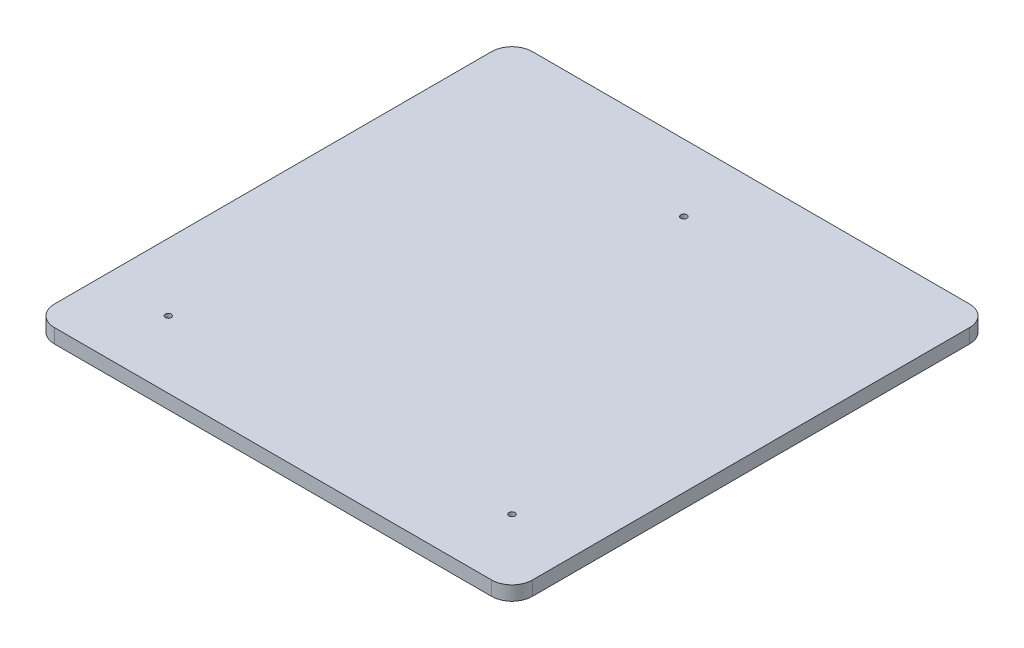
ISO-10303-21;
HEADER;
FILE_DESCRIPTION(('STEP AP214'),'2;1');
FILE_NAME('part.step','',(''),(''),'','','');
FILE_SCHEMA(('AUTOMOTIVE_DESIGN { 1 0 10303 214 1 1 1 1 }'));
ENDSEC;
DATA;
#1=APPLICATION_CONTEXT('core data for automotive mechanical design processes');
#2=APPLICATION_PROTOCOL_DEFINITION('international standard','automotive_design',2000,#1);
#3=PRODUCT_CONTEXT('',#1,'mechanical');
#4=PRODUCT('Part','Part','',(#3));
#5=PRODUCT_RELATED_PRODUCT_CATEGORY('part','',(#4));
#6=PRODUCT_DEFINITION_FORMATION('','',#4);
#7=PRODUCT_DEFINITION_CONTEXT('part definition',#1,'design');
#8=PRODUCT_DEFINITION('design','',#6,#7);
#9=PRODUCT_DEFINITION_SHAPE('','',#8);
#10=(LENGTH_UNIT() NAMED_UNIT(*) SI_UNIT(.MILLI.,.METRE.));
#11=(NAMED_UNIT(*) PLANE_ANGLE_UNIT() SI_UNIT($,.RADIAN.));
#12=(NAMED_UNIT(*) SI_UNIT($,.STERADIAN.) SOLID_ANGLE_UNIT());
#13=UNCERTAINTY_MEASURE_WITH_UNIT(LENGTH_MEASURE(1.E-05),#10,'distance_accuracy_value','');
#14=(GEOMETRIC_REPRESENTATION_CONTEXT(3) GLOBAL_UNCERTAINTY_ASSIGNED_CONTEXT((#13)) GLOBAL_UNIT_ASSIGNED_CONTEXT((#10,
#11,#12)) REPRESENTATION_CONTEXT('',''));
#15=CARTESIAN_POINT('',(0.,0.,0.));
#16=DIRECTION('',(0.,0.,1.));
#17=DIRECTION('',(1.,0.,0.));
#18=AXIS2_PLACEMENT_3D('',#15,#16,#17);
#19=CARTESIAN_POINT('',(0.,7.,0.));
#20=DIRECTION('',(0.,-1.,0.));
#21=DIRECTION('',(0.,0.,-1.));
#22=AXIS2_PLACEMENT_3D('',#19,#20,#21);
#23=PLANE('',#22);
#24=DIRECTION('',(0.,0.,1.));
#25=VECTOR('',#24,1.);
#26=CARTESIAN_POINT('',(-117.5,7.,117.5));
#27=LINE('',#26,#25);
#28=CARTESIAN_POINT('',(-117.5,7.,-107.5));
#29=VERTEX_POINT('',#28);
#30=CARTESIAN_POINT('',(-117.5,7.,107.5));
#31=VERTEX_POINT('',#30);
#32=EDGE_CURVE('E176',#29,#31,#27,.T.);
#33=ORIENTED_EDGE('',*,*,#32,.T.);
#34=CARTESIAN_POINT('',(-107.5,7.,107.5));
#35=DIRECTION('',(0.,-1.,0.));
#36=DIRECTION('',(0.,0.,-1.));
#37=AXIS2_PLACEMENT_3D('',#34,#35,#36);
#38=CIRCLE('',#37,10.);
#39=CARTESIAN_POINT('',(-107.5,7.,117.5));
#40=VERTEX_POINT('',#39);
#41=EDGE_CURVE('E153',#31,#40,#38,.F.);
#42=ORIENTED_EDGE('',*,*,#41,.T.);
#43=DIRECTION('',(1.,0.,0.));
#44=VECTOR('',#43,1.);
#45=CARTESIAN_POINT('',(-117.5,7.,117.5));
#46=LINE('',#45,#44);
#47=CARTESIAN_POINT('',(107.5,7.,117.5));
#48=VERTEX_POINT('',#47);
#49=EDGE_CURVE('E124',#40,#48,#46,.T.);
#50=ORIENTED_EDGE('',*,*,#49,.T.);
#51=CARTESIAN_POINT('',(107.5,7.,107.5));
#52=DIRECTION('',(0.,-1.,0.));
#53=DIRECTION('',(0.,0.,-1.));
#54=AXIS2_PLACEMENT_3D('',#51,#52,#53);
#55=CIRCLE('',#54,10.);
#56=CARTESIAN_POINT('',(117.5,7.,107.5));
#57=VERTEX_POINT('',#56);
#58=EDGE_CURVE('E148',#48,#57,#55,.F.);
#59=ORIENTED_EDGE('',*,*,#58,.T.);
#60=DIRECTION('',(0.,0.,-1.));
#61=VECTOR('',#60,1.);
#62=CARTESIAN_POINT('',(117.5,7.,117.5));
#63=LINE('',#62,#61);
#64=CARTESIAN_POINT('',(117.5,7.,-107.5));
#65=VERTEX_POINT('',#64);
#66=EDGE_CURVE('E131',#57,#65,#63,.T.);
#67=ORIENTED_EDGE('',*,*,#66,.T.);
#68=CARTESIAN_POINT('',(107.5,7.,-107.5));
#69=DIRECTION('',(0.,-1.,0.));
#70=DIRECTION('',(0.,0.,-1.));
#71=AXIS2_PLACEMENT_3D('',#68,#69,#70);
#72=CIRCLE('',#71,10.);
#73=CARTESIAN_POINT('',(107.5,7.,-117.5));
#74=VERTEX_POINT('',#73);
#75=EDGE_CURVE('E60',#65,#74,#72,.F.);
#76=ORIENTED_EDGE('',*,*,#75,.T.);
#77=DIRECTION('',(-1.,0.,0.));
#78=VECTOR('',#77,1.);
#79=CARTESIAN_POINT('',(-117.5,7.,-117.5));
#80=LINE('',#79,#78);
#81=CARTESIAN_POINT('',(-107.5,7.,-117.5));
#82=VERTEX_POINT('',#81);
#83=EDGE_CURVE('E134',#74,#82,#80,.T.);
#84=ORIENTED_EDGE('',*,*,#83,.T.);
#85=CARTESIAN_POINT('',(-107.5,7.,-107.5));
#86=DIRECTION('',(0.,-1.,0.));
#87=DIRECTION('',(0.,0.,-1.));
#88=AXIS2_PLACEMENT_3D('',#85,#86,#87);
#89=CIRCLE('',#88,10.);
#90=EDGE_CURVE('E151',#82,#29,#89,.F.);
#91=ORIENTED_EDGE('',*,*,#90,.T.);
#92=EDGE_LOOP('',(#33,#42,#50,#59,#67,#76,#84,#91));
#93=FACE_BOUND('',#92,.T.);
#94=CARTESIAN_POINT('',(84.5,7.,84.4999999999999));
#95=DIRECTION('',(0.,1.,0.));
#96=DIRECTION('',(0.,0.,1.));
#97=AXIS2_PLACEMENT_3D('',#94,#95,#96);
#98=CIRCLE('',#97,1.5);
#99=CARTESIAN_POINT('',(84.5,7.,86.));
#100=VERTEX_POINT('',#99);
#101=EDGE_CURVE('E169',#100,#100,#98,.T.);
#102=ORIENTED_EDGE('',*,*,#101,.F.);
#103=EDGE_LOOP('',(#102));
#104=FACE_BOUND('',#103,.T.);
#105=CARTESIAN_POINT('',(-84.5,7.,84.5));
#106=DIRECTION('',(0.,1.,0.));
#107=DIRECTION('',(0.,0.,1.));
#108=AXIS2_PLACEMENT_3D('',#105,#106,#107);
#109=CIRCLE('',#108,1.5);
#110=CARTESIAN_POINT('',(-84.5,7.,86.));
#111=VERTEX_POINT('',#110);
#112=EDGE_CURVE('E181',#111,#111,#109,.T.);
#113=ORIENTED_EDGE('',*,*,#112,.F.);
#114=EDGE_LOOP('',(#113));
#115=FACE_BOUND('',#114,.T.);
#116=CARTESIAN_POINT('',(0.,7.,-84.5));
#117=DIRECTION('',(0.,1.,0.));
#118=DIRECTION('',(0.,0.,1.));
#119=AXIS2_PLACEMENT_3D('',#116,#117,#118);
#120=CIRCLE('',#119,1.5);
#121=CARTESIAN_POINT('',(0.,7.,-83.));
#122=VERTEX_POINT('',#121);
#123=EDGE_CURVE('E186',#122,#122,#120,.T.);
#124=ORIENTED_EDGE('',*,*,#123,.F.);
#125=EDGE_LOOP('',(#124));
#126=FACE_BOUND('',#125,.T.);
#127=ADVANCED_FACE('F38',(#93,#104,#115,#126),#23,.F.);
#128=CARTESIAN_POINT('',(0.,0.,0.));
#129=DIRECTION('',(0.,-1.,0.));
#130=DIRECTION('',(0.,0.,-1.));
#131=AXIS2_PLACEMENT_3D('',#128,#129,#130);
#132=PLANE('',#131);
#133=CARTESIAN_POINT('',(-84.5,0.,84.5));
#134=DIRECTION('',(0.,1.,0.));
#135=DIRECTION('',(0.,0.,1.));
#136=AXIS2_PLACEMENT_3D('',#133,#134,#135);
#137=CIRCLE('',#136,1.5);
#138=CARTESIAN_POINT('',(-84.5,0.,86.));
#139=VERTEX_POINT('',#138);
#140=EDGE_CURVE('E183',#139,#139,#137,.T.);
#141=ORIENTED_EDGE('',*,*,#140,.T.);
#142=EDGE_LOOP('',(#141));
#143=FACE_BOUND('',#142,.T.);
#144=DIRECTION('',(1.,0.,0.));
#145=VECTOR('',#144,1.);
#146=CARTESIAN_POINT('',(-117.5,0.,117.5));
#147=LINE('',#146,#145);
#148=CARTESIAN_POINT('',(-107.5,0.,117.5));
#149=VERTEX_POINT('',#148);
#150=CARTESIAN_POINT('',(107.5,0.,117.5));
#151=VERTEX_POINT('',#150);
#152=EDGE_CURVE('E121',#149,#151,#147,.T.);
#153=ORIENTED_EDGE('',*,*,#152,.F.);
#154=CARTESIAN_POINT('',(-107.5,0.,107.5));
#155=DIRECTION('',(0.,-1.,0.));
#156=DIRECTION('',(0.,0.,-1.));
#157=AXIS2_PLACEMENT_3D('',#154,#155,#156);
#158=CIRCLE('',#157,10.);
#159=CARTESIAN_POINT('',(-117.5,0.,107.5));
#160=VERTEX_POINT('',#159);
#161=EDGE_CURVE('E104',#149,#160,#158,.T.);
#162=ORIENTED_EDGE('',*,*,#161,.T.);
#163=DIRECTION('',(0.,0.,1.));
#164=VECTOR('',#163,1.);
#165=CARTESIAN_POINT('',(-117.5,0.,117.5));
#166=LINE('',#165,#164);
#167=CARTESIAN_POINT('',(-117.5,0.,-107.5));
#168=VERTEX_POINT('',#167);
#169=EDGE_CURVE('E132',#168,#160,#166,.T.);
#170=ORIENTED_EDGE('',*,*,#169,.F.);
#171=CARTESIAN_POINT('',(-107.5,0.,-107.5));
#172=DIRECTION('',(0.,-1.,0.));
#173=DIRECTION('',(0.,0.,-1.));
#174=AXIS2_PLACEMENT_3D('',#171,#172,#173);
#175=CIRCLE('',#174,10.);
#176=CARTESIAN_POINT('',(-107.5,0.,-117.5));
#177=VERTEX_POINT('',#176);
#178=EDGE_CURVE('E115',#168,#177,#175,.T.);
#179=ORIENTED_EDGE('',*,*,#178,.T.);
#180=DIRECTION('',(-1.,0.,0.));
#181=VECTOR('',#180,1.);
#182=CARTESIAN_POINT('',(-117.5,0.,-117.5));
#183=LINE('',#182,#181);
#184=CARTESIAN_POINT('',(107.5,0.,-117.5));
#185=VERTEX_POINT('',#184);
#186=EDGE_CURVE('E136',#185,#177,#183,.T.);
#187=ORIENTED_EDGE('',*,*,#186,.F.);
#188=CARTESIAN_POINT('',(107.5,0.,-107.5));
#189=DIRECTION('',(0.,-1.,0.));
#190=DIRECTION('',(0.,0.,-1.));
#191=AXIS2_PLACEMENT_3D('',#188,#189,#190);
#192=CIRCLE('',#191,10.);
#193=CARTESIAN_POINT('',(117.5,0.,-107.5));
#194=VERTEX_POINT('',#193);
#195=EDGE_CURVE('E142',#185,#194,#192,.T.);
#196=ORIENTED_EDGE('',*,*,#195,.T.);
#197=DIRECTION('',(0.,0.,-1.));
#198=VECTOR('',#197,1.);
#199=CARTESIAN_POINT('',(117.5,0.,117.5));
#200=LINE('',#199,#198);
#201=CARTESIAN_POINT('',(117.5,0.,107.5));
#202=VERTEX_POINT('',#201);
#203=EDGE_CURVE('E164',#202,#194,#200,.T.);
#204=ORIENTED_EDGE('',*,*,#203,.F.);
#205=CARTESIAN_POINT('',(107.5,0.,107.5));
#206=DIRECTION('',(0.,-1.,0.));
#207=DIRECTION('',(0.,0.,-1.));
#208=AXIS2_PLACEMENT_3D('',#205,#206,#207);
#209=CIRCLE('',#208,10.);
#210=EDGE_CURVE('E125',#202,#151,#209,.T.);
#211=ORIENTED_EDGE('',*,*,#210,.T.);
#212=EDGE_LOOP('',(#153,#162,#170,#179,#187,#196,#204,#211));
#213=FACE_BOUND('',#212,.T.);
#214=CARTESIAN_POINT('',(84.5,0.,84.4999999999999));
#215=DIRECTION('',(0.,1.,0.));
#216=DIRECTION('',(0.,0.,1.));
#217=AXIS2_PLACEMENT_3D('',#214,#215,#216);
#218=CIRCLE('',#217,1.5);
#219=CARTESIAN_POINT('',(84.5,0.,86.));
#220=VERTEX_POINT('',#219);
#221=EDGE_CURVE('E172',#220,#220,#218,.T.);
#222=ORIENTED_EDGE('',*,*,#221,.T.);
#223=EDGE_LOOP('',(#222));
#224=FACE_BOUND('',#223,.T.);
#225=CARTESIAN_POINT('',(0.,0.,-84.5));
#226=DIRECTION('',(0.,1.,0.));
#227=DIRECTION('',(0.,0.,1.));
#228=AXIS2_PLACEMENT_3D('',#225,#226,#227);
#229=CIRCLE('',#228,1.5);
#230=CARTESIAN_POINT('',(0.,0.,-83.));
#231=VERTEX_POINT('',#230);
#232=EDGE_CURVE('E189',#231,#231,#229,.T.);
#233=ORIENTED_EDGE('',*,*,#232,.T.);
#234=EDGE_LOOP('',(#233));
#235=FACE_BOUND('',#234,.T.);
#236=ADVANCED_FACE('F128',(#143,#213,#224,#235),#132,.T.);
#237=CARTESIAN_POINT('',(117.5,7.,117.5));
#238=DIRECTION('',(-1.,0.,0.));
#239=DIRECTION('',(0.,0.,1.));
#240=AXIS2_PLACEMENT_3D('',#237,#238,#239);
#241=PLANE('',#240);
#242=ORIENTED_EDGE('',*,*,#203,.T.);
#243=DIRECTION('',(0.,-1.,0.));
#244=VECTOR('',#243,1.);
#245=CARTESIAN_POINT('',(117.5,7.,-107.5));
#246=LINE('',#245,#244);
#247=EDGE_CURVE('E11',#194,#65,#246,.F.);
#248=ORIENTED_EDGE('',*,*,#247,.T.);
#249=ORIENTED_EDGE('',*,*,#66,.F.);
#250=DIRECTION('',(0.,-1.,0.));
#251=VECTOR('',#250,1.);
#252=CARTESIAN_POINT('',(117.5,7.,107.5));
#253=LINE('',#252,#251);
#254=EDGE_CURVE('E46',#57,#202,#253,.T.);
#255=ORIENTED_EDGE('',*,*,#254,.T.);
#256=EDGE_LOOP('',(#242,#248,#249,#255));
#257=FACE_BOUND('',#256,.T.);
#258=ADVANCED_FACE('F163',(#257),#241,.F.);
#259=CARTESIAN_POINT('',(-117.5,7.,-117.5));
#260=DIRECTION('',(0.,0.,1.));
#261=DIRECTION('',(1.,0.,0.));
#262=AXIS2_PLACEMENT_3D('',#259,#260,#261);
#263=PLANE('',#262);
#264=ORIENTED_EDGE('',*,*,#186,.T.);
#265=DIRECTION('',(0.,-1.,0.));
#266=VECTOR('',#265,1.);
#267=CARTESIAN_POINT('',(-107.5,7.,-117.5));
#268=LINE('',#267,#266);
#269=EDGE_CURVE('E53',#177,#82,#268,.F.);
#270=ORIENTED_EDGE('',*,*,#269,.T.);
#271=ORIENTED_EDGE('',*,*,#83,.F.);
#272=DIRECTION('',(0.,-1.,0.));
#273=VECTOR('',#272,1.);
#274=CARTESIAN_POINT('',(107.5,7.,-117.5));
#275=LINE('',#274,#273);
#276=EDGE_CURVE('E155',#74,#185,#275,.T.);
#277=ORIENTED_EDGE('',*,*,#276,.T.);
#278=EDGE_LOOP('',(#264,#270,#271,#277));
#279=FACE_BOUND('',#278,.T.);
#280=ADVANCED_FACE('F215',(#279),#263,.F.);
#281=CARTESIAN_POINT('',(-117.5,7.,117.5));
#282=DIRECTION('',(1.,0.,0.));
#283=DIRECTION('',(0.,0.,-1.));
#284=AXIS2_PLACEMENT_3D('',#281,#282,#283);
#285=PLANE('',#284);
#286=ORIENTED_EDGE('',*,*,#169,.T.);
#287=DIRECTION('',(0.,-1.,0.));
#288=VECTOR('',#287,1.);
#289=CARTESIAN_POINT('',(-117.5,7.,107.5));
#290=LINE('',#289,#288);
#291=EDGE_CURVE('E109',#160,#31,#290,.F.);
#292=ORIENTED_EDGE('',*,*,#291,.T.);
#293=ORIENTED_EDGE('',*,*,#32,.F.);
#294=DIRECTION('',(0.,-1.,0.));
#295=VECTOR('',#294,1.);
#296=CARTESIAN_POINT('',(-117.5,7.,-107.5));
#297=LINE('',#296,#295);
#298=EDGE_CURVE('E114',#29,#168,#297,.T.);
#299=ORIENTED_EDGE('',*,*,#298,.T.);
#300=EDGE_LOOP('',(#286,#292,#293,#299));
#301=FACE_BOUND('',#300,.T.);
#302=ADVANCED_FACE('F212',(#301),#285,.F.);
#303=CARTESIAN_POINT('',(-117.5,7.,117.5));
#304=DIRECTION('',(0.,0.,-1.));
#305=DIRECTION('',(-1.,0.,0.));
#306=AXIS2_PLACEMENT_3D('',#303,#304,#305);
#307=PLANE('',#306);
#308=ORIENTED_EDGE('',*,*,#49,.F.);
#309=DIRECTION('',(0.,-1.,0.));
#310=VECTOR('',#309,1.);
#311=CARTESIAN_POINT('',(-107.5,7.,117.5));
#312=LINE('',#311,#310);
#313=EDGE_CURVE('E108',#40,#149,#312,.T.);
#314=ORIENTED_EDGE('',*,*,#313,.T.);
#315=ORIENTED_EDGE('',*,*,#152,.T.);
#316=DIRECTION('',(0.,-1.,0.));
#317=VECTOR('',#316,1.);
#318=CARTESIAN_POINT('',(107.5,7.,117.5));
#319=LINE('',#318,#317);
#320=EDGE_CURVE('E126',#151,#48,#319,.F.);
#321=ORIENTED_EDGE('',*,*,#320,.T.);
#322=EDGE_LOOP('',(#308,#314,#315,#321));
#323=FACE_BOUND('',#322,.T.);
#324=ADVANCED_FACE('F120',(#323),#307,.F.);
#325=CARTESIAN_POINT('',(84.5,7.,84.4999999999999));
#326=DIRECTION('',(0.,-1.,0.));
#327=DIRECTION('',(0.,0.,-1.));
#328=AXIS2_PLACEMENT_3D('',#325,#326,#327);
#329=CYLINDRICAL_SURFACE('',#328,1.5);
#330=ORIENTED_EDGE('',*,*,#101,.T.);
#331=EDGE_LOOP('',(#330));
#332=FACE_BOUND('',#331,.T.);
#333=ORIENTED_EDGE('',*,*,#221,.F.);
#334=EDGE_LOOP('',(#333));
#335=FACE_BOUND('',#334,.T.);
#336=ADVANCED_FACE('F207',(#332,#335),#329,.F.);
#337=CARTESIAN_POINT('',(-84.5,7.,84.5));
#338=DIRECTION('',(0.,-1.,0.));
#339=DIRECTION('',(0.,0.,-1.));
#340=AXIS2_PLACEMENT_3D('',#337,#338,#339);
#341=CYLINDRICAL_SURFACE('',#340,1.5);
#342=ORIENTED_EDGE('',*,*,#112,.T.);
#343=EDGE_LOOP('',(#342));
#344=FACE_BOUND('',#343,.T.);
#345=ORIENTED_EDGE('',*,*,#140,.F.);
#346=EDGE_LOOP('',(#345));
#347=FACE_BOUND('',#346,.T.);
#348=ADVANCED_FACE('F301',(#344,#347),#341,.F.);
#349=CARTESIAN_POINT('',(0.,7.,-84.5));
#350=DIRECTION('',(0.,-1.,0.));
#351=DIRECTION('',(0.,0.,-1.));
#352=AXIS2_PLACEMENT_3D('',#349,#350,#351);
#353=CYLINDRICAL_SURFACE('',#352,1.5);
#354=ORIENTED_EDGE('',*,*,#123,.T.);
#355=EDGE_LOOP('',(#354));
#356=FACE_BOUND('',#355,.T.);
#357=ORIENTED_EDGE('',*,*,#232,.F.);
#358=EDGE_LOOP('',(#357));
#359=FACE_BOUND('',#358,.T.);
#360=ADVANCED_FACE('F195',(#356,#359),#353,.F.);
#361=CARTESIAN_POINT('',(-107.5,7.,107.5));
#362=DIRECTION('',(0.,-1.,0.));
#363=DIRECTION('',(0.,0.,-1.));
#364=AXIS2_PLACEMENT_3D('',#361,#362,#363);
#365=CYLINDRICAL_SURFACE('',#364,10.);
#366=ORIENTED_EDGE('',*,*,#41,.F.);
#367=ORIENTED_EDGE('',*,*,#291,.F.);
#368=ORIENTED_EDGE('',*,*,#161,.F.);
#369=ORIENTED_EDGE('',*,*,#313,.F.);
#370=EDGE_LOOP('',(#366,#367,#368,#369));
#371=FACE_BOUND('',#370,.T.);
#372=ADVANCED_FACE('F107',(#371),#365,.T.);
#373=CARTESIAN_POINT('',(-107.5,7.,-107.5));
#374=DIRECTION('',(0.,-1.,0.));
#375=DIRECTION('',(0.,0.,-1.));
#376=AXIS2_PLACEMENT_3D('',#373,#374,#375);
#377=CYLINDRICAL_SURFACE('',#376,10.);
#378=ORIENTED_EDGE('',*,*,#90,.F.);
#379=ORIENTED_EDGE('',*,*,#269,.F.);
#380=ORIENTED_EDGE('',*,*,#178,.F.);
#381=ORIENTED_EDGE('',*,*,#298,.F.);
#382=EDGE_LOOP('',(#378,#379,#380,#381));
#383=FACE_BOUND('',#382,.T.);
#384=ADVANCED_FACE('F223',(#383),#377,.T.);
#385=CARTESIAN_POINT('',(107.5,7.,-107.5));
#386=DIRECTION('',(0.,-1.,0.));
#387=DIRECTION('',(0.,0.,-1.));
#388=AXIS2_PLACEMENT_3D('',#385,#386,#387);
#389=CYLINDRICAL_SURFACE('',#388,10.);
#390=ORIENTED_EDGE('',*,*,#75,.F.);
#391=ORIENTED_EDGE('',*,*,#247,.F.);
#392=ORIENTED_EDGE('',*,*,#195,.F.);
#393=ORIENTED_EDGE('',*,*,#276,.F.);
#394=EDGE_LOOP('',(#390,#391,#392,#393));
#395=FACE_BOUND('',#394,.T.);
#396=ADVANCED_FACE('F225',(#395),#389,.T.);
#397=CARTESIAN_POINT('',(107.5,7.,107.5));
#398=DIRECTION('',(0.,-1.,0.));
#399=DIRECTION('',(0.,0.,-1.));
#400=AXIS2_PLACEMENT_3D('',#397,#398,#399);
#401=CYLINDRICAL_SURFACE('',#400,10.);
#402=ORIENTED_EDGE('',*,*,#58,.F.);
#403=ORIENTED_EDGE('',*,*,#320,.F.);
#404=ORIENTED_EDGE('',*,*,#210,.F.);
#405=ORIENTED_EDGE('',*,*,#254,.F.);
#406=EDGE_LOOP('',(#402,#403,#404,#405));
#407=FACE_BOUND('',#406,.T.);
#408=ADVANCED_FACE('F40',(#407),#401,.T.);
#409=CLOSED_SHELL('',(#127,#236,#258,#280,#302,#324,#336,#348,#360,#372,#384,#396,#408));
#410=MANIFOLD_SOLID_BREP('B2',#409);
#411=ADVANCED_BREP_SHAPE_REPRESENTATION('',(#18,#410),#14);
#412=SHAPE_DEFINITION_REPRESENTATION(#9,#411);
ENDSEC;
END-ISO-10303-21;
